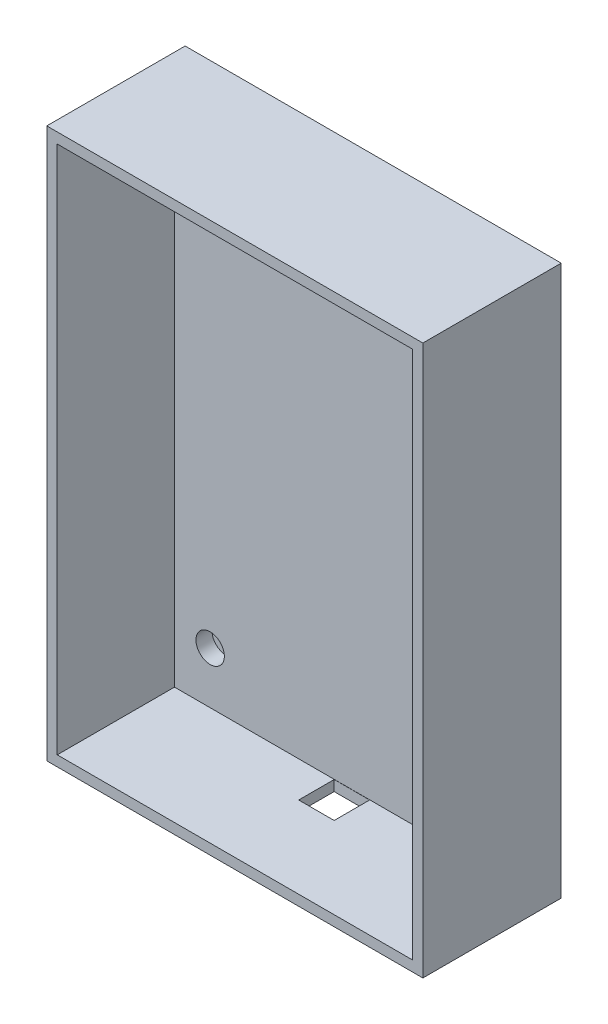
ISO-10303-21;
HEADER;
FILE_DESCRIPTION(('STEP AP214'),'2;1');
FILE_NAME('part.step','',(''),(''),'','','');
FILE_SCHEMA(('AUTOMOTIVE_DESIGN { 1 0 10303 214 1 1 1 1 }'));
ENDSEC;
DATA;
#1=APPLICATION_CONTEXT('core data for automotive mechanical design processes');
#2=APPLICATION_PROTOCOL_DEFINITION('international standard','automotive_design',2000,#1);
#3=PRODUCT_CONTEXT('',#1,'mechanical');
#4=PRODUCT('Part','Part','',(#3));
#5=PRODUCT_RELATED_PRODUCT_CATEGORY('part','',(#4));
#6=PRODUCT_DEFINITION_FORMATION('','',#4);
#7=PRODUCT_DEFINITION_CONTEXT('part definition',#1,'design');
#8=PRODUCT_DEFINITION('design','',#6,#7);
#9=PRODUCT_DEFINITION_SHAPE('','',#8);
#10=(LENGTH_UNIT() NAMED_UNIT(*) SI_UNIT(.MILLI.,.METRE.));
#11=(NAMED_UNIT(*) PLANE_ANGLE_UNIT() SI_UNIT($,.RADIAN.));
#12=(NAMED_UNIT(*) SI_UNIT($,.STERADIAN.) SOLID_ANGLE_UNIT());
#13=UNCERTAINTY_MEASURE_WITH_UNIT(LENGTH_MEASURE(1.E-05),#10,'distance_accuracy_value','');
#14=(GEOMETRIC_REPRESENTATION_CONTEXT(3) GLOBAL_UNCERTAINTY_ASSIGNED_CONTEXT((#13)) GLOBAL_UNIT_ASSIGNED_CONTEXT((#10,
#11,#12)) REPRESENTATION_CONTEXT('',''));
#15=CARTESIAN_POINT('',(0.,0.,0.));
#16=DIRECTION('',(0.,0.,1.));
#17=DIRECTION('',(1.,0.,0.));
#18=AXIS2_PLACEMENT_3D('',#15,#16,#17);
#19=CARTESIAN_POINT('',(53.,77.5,36.));
#20=DIRECTION('',(-1.,0.,0.));
#21=DIRECTION('',(0.,-1.,0.));
#22=AXIS2_PLACEMENT_3D('',#19,#20,#21);
#23=PLANE('',#22);
#24=DIRECTION('',(0.,0.,-1.));
#25=VECTOR('',#24,1.);
#26=CARTESIAN_POINT('',(53.,-77.5,36.));
#27=LINE('',#26,#25);
#28=CARTESIAN_POINT('',(53.,-77.5,36.));
#29=VERTEX_POINT('',#28);
#30=CARTESIAN_POINT('',(53.,-77.5,-3.));
#31=VERTEX_POINT('',#30);
#32=EDGE_CURVE('E135',#29,#31,#27,.T.);
#33=ORIENTED_EDGE('',*,*,#32,.T.);
#34=DIRECTION('',(0.,-1.,0.));
#35=VECTOR('',#34,1.);
#36=CARTESIAN_POINT('',(53.,77.5,-3.));
#37=LINE('',#36,#35);
#38=CARTESIAN_POINT('',(53.,77.5,-3.));
#39=VERTEX_POINT('',#38);
#40=EDGE_CURVE('E139',#39,#31,#37,.T.);
#41=ORIENTED_EDGE('',*,*,#40,.F.);
#42=DIRECTION('',(0.,0.,-1.));
#43=VECTOR('',#42,1.);
#44=CARTESIAN_POINT('',(53.,77.5,36.));
#45=LINE('',#44,#43);
#46=CARTESIAN_POINT('',(53.,77.5,36.));
#47=VERTEX_POINT('',#46);
#48=EDGE_CURVE('E257',#47,#39,#45,.T.);
#49=ORIENTED_EDGE('',*,*,#48,.F.);
#50=DIRECTION('',(0.,1.,0.));
#51=VECTOR('',#50,1.);
#52=CARTESIAN_POINT('',(53.,77.5,36.));
#53=LINE('',#52,#51);
#54=EDGE_CURVE('E141',#29,#47,#53,.T.);
#55=ORIENTED_EDGE('',*,*,#54,.F.);
#56=EDGE_LOOP('',(#33,#41,#49,#55));
#57=FACE_BOUND('',#56,.T.);
#58=ADVANCED_FACE('F43',(#57),#23,.F.);
#59=CARTESIAN_POINT('',(-53.,77.5,36.));
#60=DIRECTION('',(0.,-1.,0.));
#61=DIRECTION('',(0.,0.,-1.));
#62=AXIS2_PLACEMENT_3D('',#59,#60,#61);
#63=PLANE('',#62);
#64=ORIENTED_EDGE('',*,*,#48,.T.);
#65=DIRECTION('',(1.,0.,0.));
#66=VECTOR('',#65,1.);
#67=CARTESIAN_POINT('',(53.,77.5,-3.));
#68=LINE('',#67,#66);
#69=CARTESIAN_POINT('',(-53.,77.5,-3.));
#70=VERTEX_POINT('',#69);
#71=EDGE_CURVE('E161',#70,#39,#68,.T.);
#72=ORIENTED_EDGE('',*,*,#71,.F.);
#73=DIRECTION('',(0.,0.,-1.));
#74=VECTOR('',#73,1.);
#75=CARTESIAN_POINT('',(-53.,77.5,36.));
#76=LINE('',#75,#74);
#77=CARTESIAN_POINT('',(-53.,77.5,36.));
#78=VERTEX_POINT('',#77);
#79=EDGE_CURVE('E254',#78,#70,#76,.T.);
#80=ORIENTED_EDGE('',*,*,#79,.F.);
#81=DIRECTION('',(-1.,0.,0.));
#82=VECTOR('',#81,1.);
#83=CARTESIAN_POINT('',(-53.,77.5,36.));
#84=LINE('',#83,#82);
#85=EDGE_CURVE('E244',#47,#78,#84,.T.);
#86=ORIENTED_EDGE('',*,*,#85,.F.);
#87=EDGE_LOOP('',(#64,#72,#80,#86));
#88=FACE_BOUND('',#87,.T.);
#89=ADVANCED_FACE('F329',(#88),#63,.F.);
#90=CARTESIAN_POINT('',(-53.,77.5,36.));
#91=DIRECTION('',(1.,0.,0.));
#92=DIRECTION('',(0.,1.,0.));
#93=AXIS2_PLACEMENT_3D('',#90,#91,#92);
#94=PLANE('',#93);
#95=ORIENTED_EDGE('',*,*,#79,.T.);
#96=DIRECTION('',(0.,1.,0.));
#97=VECTOR('',#96,1.);
#98=CARTESIAN_POINT('',(-53.,77.5,-3.));
#99=LINE('',#98,#97);
#100=CARTESIAN_POINT('',(-53.,-77.5,-3.));
#101=VERTEX_POINT('',#100);
#102=EDGE_CURVE('E156',#101,#70,#99,.T.);
#103=ORIENTED_EDGE('',*,*,#102,.F.);
#104=DIRECTION('',(0.,0.,-1.));
#105=VECTOR('',#104,1.);
#106=CARTESIAN_POINT('',(-53.,-77.5,36.));
#107=LINE('',#106,#105);
#108=CARTESIAN_POINT('',(-53.,-77.5,36.));
#109=VERTEX_POINT('',#108);
#110=EDGE_CURVE('E145',#109,#101,#107,.T.);
#111=ORIENTED_EDGE('',*,*,#110,.F.);
#112=DIRECTION('',(0.,-1.,0.));
#113=VECTOR('',#112,1.);
#114=CARTESIAN_POINT('',(-53.,77.5,36.));
#115=LINE('',#114,#113);
#116=EDGE_CURVE('E247',#78,#109,#115,.T.);
#117=ORIENTED_EDGE('',*,*,#116,.F.);
#118=EDGE_LOOP('',(#95,#103,#111,#117));
#119=FACE_BOUND('',#118,.T.);
#120=ADVANCED_FACE('F333',(#119),#94,.F.);
#121=CARTESIAN_POINT('',(-53.,-77.5,36.));
#122=DIRECTION('',(0.,1.,0.));
#123=DIRECTION('',(0.,0.,1.));
#124=AXIS2_PLACEMENT_3D('',#121,#122,#123);
#125=PLANE('',#124);
#126=DIRECTION('',(-1.,0.,0.));
#127=VECTOR('',#126,1.);
#128=CARTESIAN_POINT('',(-5.,-77.5,13.));
#129=LINE('',#128,#127);
#130=CARTESIAN_POINT('',(5.,-77.5,13.));
#131=VERTEX_POINT('',#130);
#132=CARTESIAN_POINT('',(-5.,-77.5,13.));
#133=VERTEX_POINT('',#132);
#134=EDGE_CURVE('E178',#131,#133,#129,.T.);
#135=ORIENTED_EDGE('',*,*,#134,.F.);
#136=DIRECTION('',(0.,0.,1.));
#137=VECTOR('',#136,1.);
#138=CARTESIAN_POINT('',(5.,-77.5,13.));
#139=LINE('',#138,#137);
#140=CARTESIAN_POINT('',(5.,-77.5,3.));
#141=VERTEX_POINT('',#140);
#142=EDGE_CURVE('E60',#141,#131,#139,.T.);
#143=ORIENTED_EDGE('',*,*,#142,.F.);
#144=DIRECTION('',(1.,0.,0.));
#145=VECTOR('',#144,1.);
#146=CARTESIAN_POINT('',(-5.,-77.5,3.));
#147=LINE('',#146,#145);
#148=CARTESIAN_POINT('',(-5.,-77.5,3.));
#149=VERTEX_POINT('',#148);
#150=EDGE_CURVE('E185',#149,#141,#147,.T.);
#151=ORIENTED_EDGE('',*,*,#150,.F.);
#152=DIRECTION('',(0.,0.,-1.));
#153=VECTOR('',#152,1.);
#154=CARTESIAN_POINT('',(-5.,-77.5,13.));
#155=LINE('',#154,#153);
#156=EDGE_CURVE('E181',#133,#149,#155,.T.);
#157=ORIENTED_EDGE('',*,*,#156,.F.);
#158=EDGE_LOOP('',(#135,#143,#151,#157));
#159=FACE_BOUND('',#158,.T.);
#160=ORIENTED_EDGE('',*,*,#110,.T.);
#161=DIRECTION('',(-1.,0.,0.));
#162=VECTOR('',#161,1.);
#163=CARTESIAN_POINT('',(53.,-77.5,-3.));
#164=LINE('',#163,#162);
#165=EDGE_CURVE('E149',#31,#101,#164,.T.);
#166=ORIENTED_EDGE('',*,*,#165,.F.);
#167=ORIENTED_EDGE('',*,*,#32,.F.);
#168=DIRECTION('',(1.,0.,0.));
#169=VECTOR('',#168,1.);
#170=CARTESIAN_POINT('',(-53.,-77.5,36.));
#171=LINE('',#170,#169);
#172=EDGE_CURVE('E146',#109,#29,#171,.T.);
#173=ORIENTED_EDGE('',*,*,#172,.F.);
#174=EDGE_LOOP('',(#160,#166,#167,#173));
#175=FACE_BOUND('',#174,.T.);
#176=ADVANCED_FACE('F150',(#159,#175),#125,.F.);
#177=CARTESIAN_POINT('',(0.,0.,36.));
#178=DIRECTION('',(0.,0.,1.));
#179=DIRECTION('',(1.,0.,0.));
#180=AXIS2_PLACEMENT_3D('',#177,#178,#179);
#181=PLANE('',#180);
#182=DIRECTION('',(0.,1.,0.));
#183=VECTOR('',#182,1.);
#184=CARTESIAN_POINT('',(50.05,77.5,36.));
#185=LINE('',#184,#183);
#186=CARTESIAN_POINT('',(50.05,-74.55,36.));
#187=VERTEX_POINT('',#186);
#188=CARTESIAN_POINT('',(50.05,74.55,36.));
#189=VERTEX_POINT('',#188);
#190=EDGE_CURVE('E230',#187,#189,#185,.T.);
#191=ORIENTED_EDGE('',*,*,#190,.F.);
#192=DIRECTION('',(1.,0.,0.));
#193=VECTOR('',#192,1.);
#194=CARTESIAN_POINT('',(-53.,-74.55,36.));
#195=LINE('',#194,#193);
#196=CARTESIAN_POINT('',(-50.05,-74.55,36.));
#197=VERTEX_POINT('',#196);
#198=EDGE_CURVE('E215',#197,#187,#195,.T.);
#199=ORIENTED_EDGE('',*,*,#198,.F.);
#200=DIRECTION('',(0.,-1.,0.));
#201=VECTOR('',#200,1.);
#202=CARTESIAN_POINT('',(-50.05,77.5,36.));
#203=LINE('',#202,#201);
#204=CARTESIAN_POINT('',(-50.05,74.55,36.));
#205=VERTEX_POINT('',#204);
#206=EDGE_CURVE('E236',#205,#197,#203,.T.);
#207=ORIENTED_EDGE('',*,*,#206,.F.);
#208=DIRECTION('',(-1.,0.,0.));
#209=VECTOR('',#208,1.);
#210=CARTESIAN_POINT('',(-53.,74.55,36.));
#211=LINE('',#210,#209);
#212=EDGE_CURVE('E233',#189,#205,#211,.T.);
#213=ORIENTED_EDGE('',*,*,#212,.F.);
#214=EDGE_LOOP('',(#191,#199,#207,#213));
#215=FACE_BOUND('',#214,.T.);
#216=ORIENTED_EDGE('',*,*,#54,.T.);
#217=ORIENTED_EDGE('',*,*,#85,.T.);
#218=ORIENTED_EDGE('',*,*,#116,.T.);
#219=ORIENTED_EDGE('',*,*,#172,.T.);
#220=EDGE_LOOP('',(#216,#217,#218,#219));
#221=FACE_BOUND('',#220,.T.);
#222=ADVANCED_FACE('F343',(#215,#221),#181,.T.);
#223=CARTESIAN_POINT('',(50.05,77.5,36.));
#224=DIRECTION('',(-1.,0.,0.));
#225=DIRECTION('',(0.,-1.,0.));
#226=AXIS2_PLACEMENT_3D('',#223,#224,#225);
#227=PLANE('',#226);
#228=DIRECTION('',(0.,1.,0.));
#229=VECTOR('',#228,1.);
#230=CARTESIAN_POINT('',(50.05,77.5,2.95));
#231=LINE('',#230,#229);
#232=CARTESIAN_POINT('',(50.05,-74.55,2.95));
#233=VERTEX_POINT('',#232);
#234=CARTESIAN_POINT('',(50.05,74.55,2.95));
#235=VERTEX_POINT('',#234);
#236=EDGE_CURVE('E193',#233,#235,#231,.T.);
#237=ORIENTED_EDGE('',*,*,#236,.F.);
#238=DIRECTION('',(0.,0.,-1.));
#239=VECTOR('',#238,1.);
#240=CARTESIAN_POINT('',(50.05,-74.55,36.));
#241=LINE('',#240,#239);
#242=EDGE_CURVE('E210',#187,#233,#241,.T.);
#243=ORIENTED_EDGE('',*,*,#242,.F.);
#244=ORIENTED_EDGE('',*,*,#190,.T.);
#245=DIRECTION('',(0.,0.,-1.));
#246=VECTOR('',#245,1.);
#247=CARTESIAN_POINT('',(50.05,74.55,36.));
#248=LINE('',#247,#246);
#249=EDGE_CURVE('E205',#189,#235,#248,.T.);
#250=ORIENTED_EDGE('',*,*,#249,.T.);
#251=EDGE_LOOP('',(#237,#243,#244,#250));
#252=FACE_BOUND('',#251,.T.);
#253=ADVANCED_FACE('F347',(#252),#227,.T.);
#254=CARTESIAN_POINT('',(-53.,74.55,36.));
#255=DIRECTION('',(0.,-1.,0.));
#256=DIRECTION('',(0.,0.,-1.));
#257=AXIS2_PLACEMENT_3D('',#254,#255,#256);
#258=PLANE('',#257);
#259=DIRECTION('',(-1.,0.,0.));
#260=VECTOR('',#259,1.);
#261=CARTESIAN_POINT('',(-53.,74.55,2.95));
#262=LINE('',#261,#260);
#263=CARTESIAN_POINT('',(-50.05,74.55,2.95));
#264=VERTEX_POINT('',#263);
#265=EDGE_CURVE('E204',#235,#264,#262,.T.);
#266=ORIENTED_EDGE('',*,*,#265,.F.);
#267=ORIENTED_EDGE('',*,*,#249,.F.);
#268=ORIENTED_EDGE('',*,*,#212,.T.);
#269=DIRECTION('',(0.,0.,-1.));
#270=VECTOR('',#269,1.);
#271=CARTESIAN_POINT('',(-50.05,74.55,36.));
#272=LINE('',#271,#270);
#273=EDGE_CURVE('E209',#205,#264,#272,.T.);
#274=ORIENTED_EDGE('',*,*,#273,.T.);
#275=EDGE_LOOP('',(#266,#267,#268,#274));
#276=FACE_BOUND('',#275,.T.);
#277=ADVANCED_FACE('F361',(#276),#258,.T.);
#278=CARTESIAN_POINT('',(-50.05,77.5,36.));
#279=DIRECTION('',(1.,0.,0.));
#280=DIRECTION('',(0.,1.,0.));
#281=AXIS2_PLACEMENT_3D('',#278,#279,#280);
#282=PLANE('',#281);
#283=DIRECTION('',(0.,-1.,0.));
#284=VECTOR('',#283,1.);
#285=CARTESIAN_POINT('',(-50.05,77.5,2.95));
#286=LINE('',#285,#284);
#287=CARTESIAN_POINT('',(-50.05,-74.55,2.95));
#288=VERTEX_POINT('',#287);
#289=EDGE_CURVE('E218',#264,#288,#286,.T.);
#290=ORIENTED_EDGE('',*,*,#289,.F.);
#291=ORIENTED_EDGE('',*,*,#273,.F.);
#292=ORIENTED_EDGE('',*,*,#206,.T.);
#293=DIRECTION('',(0.,0.,-1.));
#294=VECTOR('',#293,1.);
#295=CARTESIAN_POINT('',(-50.05,-74.55,36.));
#296=LINE('',#295,#294);
#297=EDGE_CURVE('E214',#197,#288,#296,.T.);
#298=ORIENTED_EDGE('',*,*,#297,.T.);
#299=EDGE_LOOP('',(#290,#291,#292,#298));
#300=FACE_BOUND('',#299,.T.);
#301=ADVANCED_FACE('F357',(#300),#282,.T.);
#302=CARTESIAN_POINT('',(-53.,-74.55,36.));
#303=DIRECTION('',(0.,1.,0.));
#304=DIRECTION('',(0.,0.,1.));
#305=AXIS2_PLACEMENT_3D('',#302,#303,#304);
#306=PLANE('',#305);
#307=DIRECTION('',(0.,0.,-1.));
#308=VECTOR('',#307,1.);
#309=CARTESIAN_POINT('',(4.99999999999999,-74.55,36.));
#310=LINE('',#309,#308);
#311=CARTESIAN_POINT('',(5.,-74.55,13.));
#312=VERTEX_POINT('',#311);
#313=CARTESIAN_POINT('',(5.,-74.55,3.));
#314=VERTEX_POINT('',#313);
#315=EDGE_CURVE('E11',#312,#314,#310,.T.);
#316=ORIENTED_EDGE('',*,*,#315,.F.);
#317=DIRECTION('',(1.,0.,0.));
#318=VECTOR('',#317,1.);
#319=CARTESIAN_POINT('',(-53.,-74.55,13.));
#320=LINE('',#319,#318);
#321=CARTESIAN_POINT('',(-5.,-74.55,13.));
#322=VERTEX_POINT('',#321);
#323=EDGE_CURVE('E260',#322,#312,#320,.T.);
#324=ORIENTED_EDGE('',*,*,#323,.F.);
#325=DIRECTION('',(0.,0.,1.));
#326=VECTOR('',#325,1.);
#327=CARTESIAN_POINT('',(-5.,-74.55,36.));
#328=LINE('',#327,#326);
#329=CARTESIAN_POINT('',(-5.,-74.55,3.));
#330=VERTEX_POINT('',#329);
#331=EDGE_CURVE('E263',#330,#322,#328,.T.);
#332=ORIENTED_EDGE('',*,*,#331,.F.);
#333=DIRECTION('',(-1.,0.,0.));
#334=VECTOR('',#333,1.);
#335=CARTESIAN_POINT('',(-53.,-74.55,3.));
#336=LINE('',#335,#334);
#337=EDGE_CURVE('E52',#314,#330,#336,.T.);
#338=ORIENTED_EDGE('',*,*,#337,.F.);
#339=EDGE_LOOP('',(#316,#324,#332,#338));
#340=FACE_BOUND('',#339,.T.);
#341=DIRECTION('',(1.,0.,0.));
#342=VECTOR('',#341,1.);
#343=CARTESIAN_POINT('',(-53.,-74.55,2.95));
#344=LINE('',#343,#342);
#345=EDGE_CURVE('E224',#288,#233,#344,.T.);
#346=ORIENTED_EDGE('',*,*,#345,.F.);
#347=ORIENTED_EDGE('',*,*,#297,.F.);
#348=ORIENTED_EDGE('',*,*,#198,.T.);
#349=ORIENTED_EDGE('',*,*,#242,.T.);
#350=EDGE_LOOP('',(#346,#347,#348,#349));
#351=FACE_BOUND('',#350,.T.);
#352=ADVANCED_FACE('F353',(#340,#351),#306,.T.);
#353=CARTESIAN_POINT('',(0.,0.,2.95));
#354=DIRECTION('',(0.,0.,1.));
#355=DIRECTION('',(1.,0.,0.));
#356=AXIS2_PLACEMENT_3D('',#353,#354,#355);
#357=PLANE('',#356);
#358=CARTESIAN_POINT('',(-40.,60.,2.95));
#359=DIRECTION('',(0.,0.,1.));
#360=DIRECTION('',(1.,0.,0.));
#361=AXIS2_PLACEMENT_3D('',#358,#359,#360);
#362=CIRCLE('',#361,3.99999999999999);
#363=CARTESIAN_POINT('',(-36.,60.,2.95));
#364=VERTEX_POINT('',#363);
#365=EDGE_CURVE('E462',#364,#364,#362,.T.);
#366=ORIENTED_EDGE('',*,*,#365,.F.);
#367=EDGE_LOOP('',(#366));
#368=FACE_BOUND('',#367,.T.);
#369=CARTESIAN_POINT('',(40.,60.,2.95));
#370=DIRECTION('',(0.,0.,1.));
#371=DIRECTION('',(1.,0.,0.));
#372=AXIS2_PLACEMENT_3D('',#369,#370,#371);
#373=CIRCLE('',#372,3.99999999999999);
#374=CARTESIAN_POINT('',(44.,60.,2.95));
#375=VERTEX_POINT('',#374);
#376=EDGE_CURVE('E292',#375,#375,#373,.T.);
#377=ORIENTED_EDGE('',*,*,#376,.F.);
#378=EDGE_LOOP('',(#377));
#379=FACE_BOUND('',#378,.T.);
#380=CARTESIAN_POINT('',(40.,-60.,2.95));
#381=DIRECTION('',(0.,0.,1.));
#382=DIRECTION('',(1.,0.,0.));
#383=AXIS2_PLACEMENT_3D('',#380,#381,#382);
#384=CIRCLE('',#383,3.99999999999999);
#385=CARTESIAN_POINT('',(44.,-60.,2.95));
#386=VERTEX_POINT('',#385);
#387=EDGE_CURVE('E276',#386,#386,#384,.T.);
#388=ORIENTED_EDGE('',*,*,#387,.F.);
#389=EDGE_LOOP('',(#388));
#390=FACE_BOUND('',#389,.T.);
#391=CARTESIAN_POINT('',(-40.,-60.,2.95));
#392=DIRECTION('',(0.,0.,1.));
#393=DIRECTION('',(1.,0.,0.));
#394=AXIS2_PLACEMENT_3D('',#391,#392,#393);
#395=CIRCLE('',#394,3.99999999999999);
#396=CARTESIAN_POINT('',(-36.,-60.,2.95));
#397=VERTEX_POINT('',#396);
#398=EDGE_CURVE('E271',#397,#397,#395,.T.);
#399=ORIENTED_EDGE('',*,*,#398,.F.);
#400=EDGE_LOOP('',(#399));
#401=FACE_BOUND('',#400,.T.);
#402=ORIENTED_EDGE('',*,*,#236,.T.);
#403=ORIENTED_EDGE('',*,*,#265,.T.);
#404=ORIENTED_EDGE('',*,*,#289,.T.);
#405=ORIENTED_EDGE('',*,*,#345,.T.);
#406=EDGE_LOOP('',(#402,#403,#404,#405));
#407=FACE_BOUND('',#406,.T.);
#408=ADVANCED_FACE('F349',(#368,#379,#390,#401,#407),#357,.T.);
#409=CARTESIAN_POINT('',(5.,-41.5,13.));
#410=DIRECTION('',(1.,0.,0.));
#411=DIRECTION('',(0.,0.,-1.));
#412=AXIS2_PLACEMENT_3D('',#409,#410,#411);
#413=PLANE('',#412);
#414=ORIENTED_EDGE('',*,*,#315,.T.);
#415=DIRECTION('',(0.,-1.,0.));
#416=VECTOR('',#415,1.);
#417=CARTESIAN_POINT('',(5.,-41.5,3.));
#418=LINE('',#417,#416);
#419=EDGE_CURVE('E190',#314,#141,#418,.T.);
#420=ORIENTED_EDGE('',*,*,#419,.T.);
#421=ORIENTED_EDGE('',*,*,#142,.T.);
#422=DIRECTION('',(0.,-1.,0.));
#423=VECTOR('',#422,1.);
#424=CARTESIAN_POINT('',(5.,-41.5,13.));
#425=LINE('',#424,#423);
#426=EDGE_CURVE('E189',#312,#131,#425,.T.);
#427=ORIENTED_EDGE('',*,*,#426,.F.);
#428=EDGE_LOOP('',(#414,#420,#421,#427));
#429=FACE_BOUND('',#428,.T.);
#430=ADVANCED_FACE('F352',(#429),#413,.F.);
#431=CARTESIAN_POINT('',(-5.,-41.5,3.));
#432=DIRECTION('',(0.,0.,-1.));
#433=DIRECTION('',(-1.,0.,0.));
#434=AXIS2_PLACEMENT_3D('',#431,#432,#433);
#435=PLANE('',#434);
#436=ORIENTED_EDGE('',*,*,#337,.T.);
#437=DIRECTION('',(0.,-1.,0.));
#438=VECTOR('',#437,1.);
#439=CARTESIAN_POINT('',(-5.,-41.5,3.));
#440=LINE('',#439,#438);
#441=EDGE_CURVE('E194',#330,#149,#440,.T.);
#442=ORIENTED_EDGE('',*,*,#441,.T.);
#443=ORIENTED_EDGE('',*,*,#150,.T.);
#444=ORIENTED_EDGE('',*,*,#419,.F.);
#445=EDGE_LOOP('',(#436,#442,#443,#444));
#446=FACE_BOUND('',#445,.T.);
#447=ADVANCED_FACE('F371',(#446),#435,.F.);
#448=CARTESIAN_POINT('',(-5.,-41.5,13.));
#449=DIRECTION('',(-1.,0.,0.));
#450=DIRECTION('',(0.,0.,1.));
#451=AXIS2_PLACEMENT_3D('',#448,#449,#450);
#452=PLANE('',#451);
#453=ORIENTED_EDGE('',*,*,#331,.T.);
#454=DIRECTION('',(0.,-1.,0.));
#455=VECTOR('',#454,1.);
#456=CARTESIAN_POINT('',(-5.,-41.5,13.));
#457=LINE('',#456,#455);
#458=EDGE_CURVE('E68',#322,#133,#457,.T.);
#459=ORIENTED_EDGE('',*,*,#458,.T.);
#460=ORIENTED_EDGE('',*,*,#156,.T.);
#461=ORIENTED_EDGE('',*,*,#441,.F.);
#462=EDGE_LOOP('',(#453,#459,#460,#461));
#463=FACE_BOUND('',#462,.T.);
#464=ADVANCED_FACE('F375',(#463),#452,.F.);
#465=CARTESIAN_POINT('',(-5.,-41.5,13.));
#466=DIRECTION('',(0.,0.,1.));
#467=DIRECTION('',(1.,0.,0.));
#468=AXIS2_PLACEMENT_3D('',#465,#466,#467);
#469=PLANE('',#468);
#470=ORIENTED_EDGE('',*,*,#323,.T.);
#471=ORIENTED_EDGE('',*,*,#426,.T.);
#472=ORIENTED_EDGE('',*,*,#134,.T.);
#473=ORIENTED_EDGE('',*,*,#458,.F.);
#474=EDGE_LOOP('',(#470,#471,#472,#473));
#475=FACE_BOUND('',#474,.T.);
#476=ADVANCED_FACE('F372',(#475),#469,.F.);
#477=CARTESIAN_POINT('',(0.,0.,-3.));
#478=DIRECTION('',(0.,0.,-1.));
#479=DIRECTION('',(-1.,0.,0.));
#480=AXIS2_PLACEMENT_3D('',#477,#478,#479);
#481=PLANE('',#480);
#482=CARTESIAN_POINT('',(-40.,60.,-3.));
#483=DIRECTION('',(0.,0.,-1.));
#484=DIRECTION('',(-1.,0.,0.));
#485=AXIS2_PLACEMENT_3D('',#482,#483,#484);
#486=CIRCLE('',#485,2.24999999999999);
#487=CARTESIAN_POINT('',(-42.25,60.,-3.));
#488=VERTEX_POINT('',#487);
#489=EDGE_CURVE('E46',#488,#488,#486,.T.);
#490=ORIENTED_EDGE('',*,*,#489,.F.);
#491=EDGE_LOOP('',(#490));
#492=FACE_BOUND('',#491,.T.);
#493=CARTESIAN_POINT('',(40.,60.,-3.));
#494=DIRECTION('',(0.,0.,-1.));
#495=DIRECTION('',(-1.,0.,0.));
#496=AXIS2_PLACEMENT_3D('',#493,#494,#495);
#497=CIRCLE('',#496,2.24999999999999);
#498=CARTESIAN_POINT('',(37.75,60.,-3.));
#499=VERTEX_POINT('',#498);
#500=EDGE_CURVE('E273',#499,#499,#497,.T.);
#501=ORIENTED_EDGE('',*,*,#500,.F.);
#502=EDGE_LOOP('',(#501));
#503=FACE_BOUND('',#502,.T.);
#504=CARTESIAN_POINT('',(40.,-60.,-3.));
#505=DIRECTION('',(0.,0.,-1.));
#506=DIRECTION('',(-1.,0.,0.));
#507=AXIS2_PLACEMENT_3D('',#504,#505,#506);
#508=CIRCLE('',#507,2.24999999999999);
#509=CARTESIAN_POINT('',(37.75,-60.,-3.));
#510=VERTEX_POINT('',#509);
#511=EDGE_CURVE('E268',#510,#510,#508,.T.);
#512=ORIENTED_EDGE('',*,*,#511,.F.);
#513=EDGE_LOOP('',(#512));
#514=FACE_BOUND('',#513,.T.);
#515=CARTESIAN_POINT('',(-40.,-60.,-3.));
#516=DIRECTION('',(0.,0.,-1.));
#517=DIRECTION('',(-1.,0.,0.));
#518=AXIS2_PLACEMENT_3D('',#515,#516,#517);
#519=CIRCLE('',#518,2.24999999999999);
#520=CARTESIAN_POINT('',(-42.25,-60.,-3.));
#521=VERTEX_POINT('',#520);
#522=EDGE_CURVE('E163',#521,#521,#519,.T.);
#523=ORIENTED_EDGE('',*,*,#522,.F.);
#524=EDGE_LOOP('',(#523));
#525=FACE_BOUND('',#524,.T.);
#526=ORIENTED_EDGE('',*,*,#40,.T.);
#527=ORIENTED_EDGE('',*,*,#165,.T.);
#528=ORIENTED_EDGE('',*,*,#102,.T.);
#529=ORIENTED_EDGE('',*,*,#71,.T.);
#530=EDGE_LOOP('',(#526,#527,#528,#529));
#531=FACE_BOUND('',#530,.T.);
#532=ADVANCED_FACE('F159',(#492,#503,#514,#525,#531),#481,.T.);
#533=CARTESIAN_POINT('',(-40.,-60.,2.95));
#534=DIRECTION('',(0.,0.,1.));
#535=DIRECTION('',(1.,0.,0.));
#536=AXIS2_PLACEMENT_3D('',#533,#534,#535);
#537=CYLINDRICAL_SURFACE('',#536,2.24999999999999);
#538=ORIENTED_EDGE('',*,*,#522,.T.);
#539=EDGE_LOOP('',(#538));
#540=FACE_BOUND('',#539,.T.);
#541=CARTESIAN_POINT('',(-40.,-60.,-1.55));
#542=DIRECTION('',(0.,0.,1.));
#543=DIRECTION('',(1.,0.,0.));
#544=AXIS2_PLACEMENT_3D('',#541,#542,#543);
#545=CIRCLE('',#544,2.25);
#546=CARTESIAN_POINT('',(-37.75,-60.,-1.55));
#547=VERTEX_POINT('',#546);
#548=EDGE_CURVE('E167',#547,#547,#545,.T.);
#549=ORIENTED_EDGE('',*,*,#548,.T.);
#550=EDGE_LOOP('',(#549));
#551=FACE_BOUND('',#550,.T.);
#552=ADVANCED_FACE('F313',(#540,#551),#537,.F.);
#553=CARTESIAN_POINT('',(-37.75,-60.,-1.55));
#554=DIRECTION('',(0.,0.,-1.));
#555=DIRECTION('',(-1.,0.,0.));
#556=AXIS2_PLACEMENT_3D('',#553,#554,#555);
#557=PLANE('',#556);
#558=ORIENTED_EDGE('',*,*,#548,.F.);
#559=EDGE_LOOP('',(#558));
#560=FACE_BOUND('',#559,.T.);
#561=CARTESIAN_POINT('',(-40.,-60.,-1.55));
#562=DIRECTION('',(0.,0.,1.));
#563=DIRECTION('',(1.,0.,0.));
#564=AXIS2_PLACEMENT_3D('',#561,#562,#563);
#565=CIRCLE('',#564,4.);
#566=CARTESIAN_POINT('',(-36.,-60.,-1.55));
#567=VERTEX_POINT('',#566);
#568=EDGE_CURVE('E304',#567,#567,#565,.T.);
#569=ORIENTED_EDGE('',*,*,#568,.T.);
#570=EDGE_LOOP('',(#569));
#571=FACE_BOUND('',#570,.T.);
#572=ADVANCED_FACE('F315',(#560,#571),#557,.F.);
#573=CARTESIAN_POINT('',(-40.,-60.,2.95));
#574=DIRECTION('',(0.,0.,1.));
#575=DIRECTION('',(1.,0.,0.));
#576=AXIS2_PLACEMENT_3D('',#573,#574,#575);
#577=CYLINDRICAL_SURFACE('',#576,3.99999999999999);
#578=ORIENTED_EDGE('',*,*,#568,.F.);
#579=EDGE_LOOP('',(#578));
#580=FACE_BOUND('',#579,.T.);
#581=ORIENTED_EDGE('',*,*,#398,.T.);
#582=EDGE_LOOP('',(#581));
#583=FACE_BOUND('',#582,.T.);
#584=ADVANCED_FACE('F317',(#580,#583),#577,.F.);
#585=CARTESIAN_POINT('',(40.,-60.,2.95));
#586=DIRECTION('',(0.,0.,1.));
#587=DIRECTION('',(1.,0.,0.));
#588=AXIS2_PLACEMENT_3D('',#585,#586,#587);
#589=CYLINDRICAL_SURFACE('',#588,2.24999999999999);
#590=ORIENTED_EDGE('',*,*,#511,.T.);
#591=EDGE_LOOP('',(#590));
#592=FACE_BOUND('',#591,.T.);
#593=CARTESIAN_POINT('',(40.,-60.,-1.55));
#594=DIRECTION('',(0.,0.,1.));
#595=DIRECTION('',(1.,0.,0.));
#596=AXIS2_PLACEMENT_3D('',#593,#594,#595);
#597=CIRCLE('',#596,2.25);
#598=CARTESIAN_POINT('',(42.25,-60.,-1.55));
#599=VERTEX_POINT('',#598);
#600=EDGE_CURVE('E272',#599,#599,#597,.T.);
#601=ORIENTED_EDGE('',*,*,#600,.T.);
#602=EDGE_LOOP('',(#601));
#603=FACE_BOUND('',#602,.T.);
#604=ADVANCED_FACE('F323',(#592,#603),#589,.F.);
#605=CARTESIAN_POINT('',(42.25,-60.,-1.55));
#606=DIRECTION('',(0.,0.,-1.));
#607=DIRECTION('',(-1.,0.,0.));
#608=AXIS2_PLACEMENT_3D('',#605,#606,#607);
#609=PLANE('',#608);
#610=ORIENTED_EDGE('',*,*,#600,.F.);
#611=EDGE_LOOP('',(#610));
#612=FACE_BOUND('',#611,.T.);
#613=CARTESIAN_POINT('',(40.,-60.,-1.55));
#614=DIRECTION('',(0.,0.,1.));
#615=DIRECTION('',(1.,0.,0.));
#616=AXIS2_PLACEMENT_3D('',#613,#614,#615);
#617=CIRCLE('',#616,4.);
#618=CARTESIAN_POINT('',(44.,-60.,-1.55));
#619=VERTEX_POINT('',#618);
#620=EDGE_CURVE('E283',#619,#619,#617,.T.);
#621=ORIENTED_EDGE('',*,*,#620,.T.);
#622=EDGE_LOOP('',(#621));
#623=FACE_BOUND('',#622,.T.);
#624=ADVANCED_FACE('F396',(#612,#623),#609,.F.);
#625=CARTESIAN_POINT('',(40.,-60.,2.95));
#626=DIRECTION('',(0.,0.,1.));
#627=DIRECTION('',(1.,0.,0.));
#628=AXIS2_PLACEMENT_3D('',#625,#626,#627);
#629=CYLINDRICAL_SURFACE('',#628,3.99999999999999);
#630=ORIENTED_EDGE('',*,*,#620,.F.);
#631=EDGE_LOOP('',(#630));
#632=FACE_BOUND('',#631,.T.);
#633=ORIENTED_EDGE('',*,*,#387,.T.);
#634=EDGE_LOOP('',(#633));
#635=FACE_BOUND('',#634,.T.);
#636=ADVANCED_FACE('F402',(#632,#635),#629,.F.);
#637=CARTESIAN_POINT('',(40.,60.,2.95));
#638=DIRECTION('',(0.,0.,1.));
#639=DIRECTION('',(1.,0.,0.));
#640=AXIS2_PLACEMENT_3D('',#637,#638,#639);
#641=CYLINDRICAL_SURFACE('',#640,2.24999999999999);
#642=ORIENTED_EDGE('',*,*,#500,.T.);
#643=EDGE_LOOP('',(#642));
#644=FACE_BOUND('',#643,.T.);
#645=CARTESIAN_POINT('',(40.,60.,-1.55));
#646=DIRECTION('',(0.,0.,1.));
#647=DIRECTION('',(1.,0.,0.));
#648=AXIS2_PLACEMENT_3D('',#645,#646,#647);
#649=CIRCLE('',#648,2.25);
#650=CARTESIAN_POINT('',(42.25,60.,-1.55));
#651=VERTEX_POINT('',#650);
#652=EDGE_CURVE('E277',#651,#651,#649,.T.);
#653=ORIENTED_EDGE('',*,*,#652,.T.);
#654=EDGE_LOOP('',(#653));
#655=FACE_BOUND('',#654,.T.);
#656=ADVANCED_FACE('F408',(#644,#655),#641,.F.);
#657=CARTESIAN_POINT('',(42.25,60.,-1.55));
#658=DIRECTION('',(0.,0.,-1.));
#659=DIRECTION('',(-1.,0.,0.));
#660=AXIS2_PLACEMENT_3D('',#657,#658,#659);
#661=PLANE('',#660);
#662=ORIENTED_EDGE('',*,*,#652,.F.);
#663=EDGE_LOOP('',(#662));
#664=FACE_BOUND('',#663,.T.);
#665=CARTESIAN_POINT('',(40.,60.,-1.55));
#666=DIRECTION('',(0.,0.,1.));
#667=DIRECTION('',(1.,0.,0.));
#668=AXIS2_PLACEMENT_3D('',#665,#666,#667);
#669=CIRCLE('',#668,4.);
#670=CARTESIAN_POINT('',(44.,60.,-1.55));
#671=VERTEX_POINT('',#670);
#672=EDGE_CURVE('E286',#671,#671,#669,.T.);
#673=ORIENTED_EDGE('',*,*,#672,.T.);
#674=EDGE_LOOP('',(#673));
#675=FACE_BOUND('',#674,.T.);
#676=ADVANCED_FACE('F433',(#664,#675),#661,.F.);
#677=CARTESIAN_POINT('',(40.,60.,2.95));
#678=DIRECTION('',(0.,0.,1.));
#679=DIRECTION('',(1.,0.,0.));
#680=AXIS2_PLACEMENT_3D('',#677,#678,#679);
#681=CYLINDRICAL_SURFACE('',#680,3.99999999999999);
#682=ORIENTED_EDGE('',*,*,#672,.F.);
#683=EDGE_LOOP('',(#682));
#684=FACE_BOUND('',#683,.T.);
#685=ORIENTED_EDGE('',*,*,#376,.T.);
#686=EDGE_LOOP('',(#685));
#687=FACE_BOUND('',#686,.T.);
#688=ADVANCED_FACE('F438',(#684,#687),#681,.F.);
#689=CARTESIAN_POINT('',(-40.,60.,2.95));
#690=DIRECTION('',(0.,0.,1.));
#691=DIRECTION('',(1.,0.,0.));
#692=AXIS2_PLACEMENT_3D('',#689,#690,#691);
#693=CYLINDRICAL_SURFACE('',#692,2.24999999999999);
#694=ORIENTED_EDGE('',*,*,#489,.T.);
#695=EDGE_LOOP('',(#694));
#696=FACE_BOUND('',#695,.T.);
#697=CARTESIAN_POINT('',(-40.,60.,-1.55));
#698=DIRECTION('',(0.,0.,1.));
#699=DIRECTION('',(1.,0.,0.));
#700=AXIS2_PLACEMENT_3D('',#697,#698,#699);
#701=CIRCLE('',#700,2.25);
#702=CARTESIAN_POINT('',(-37.75,60.,-1.55));
#703=VERTEX_POINT('',#702);
#704=EDGE_CURVE('E466',#703,#703,#701,.T.);
#705=ORIENTED_EDGE('',*,*,#704,.T.);
#706=EDGE_LOOP('',(#705));
#707=FACE_BOUND('',#706,.T.);
#708=ADVANCED_FACE('F442',(#696,#707),#693,.F.);
#709=CARTESIAN_POINT('',(-37.75,60.,-1.55));
#710=DIRECTION('',(0.,0.,-1.));
#711=DIRECTION('',(-1.,0.,0.));
#712=AXIS2_PLACEMENT_3D('',#709,#710,#711);
#713=PLANE('',#712);
#714=ORIENTED_EDGE('',*,*,#704,.F.);
#715=EDGE_LOOP('',(#714));
#716=FACE_BOUND('',#715,.T.);
#717=CARTESIAN_POINT('',(-40.,60.,-1.55));
#718=DIRECTION('',(0.,0.,1.));
#719=DIRECTION('',(1.,0.,0.));
#720=AXIS2_PLACEMENT_3D('',#717,#718,#719);
#721=CIRCLE('',#720,4.);
#722=CARTESIAN_POINT('',(-36.,60.,-1.55));
#723=VERTEX_POINT('',#722);
#724=EDGE_CURVE('E459',#723,#723,#721,.T.);
#725=ORIENTED_EDGE('',*,*,#724,.T.);
#726=EDGE_LOOP('',(#725));
#727=FACE_BOUND('',#726,.T.);
#728=ADVANCED_FACE('F446',(#716,#727),#713,.F.);
#729=CARTESIAN_POINT('',(-40.,60.,2.95));
#730=DIRECTION('',(0.,0.,1.));
#731=DIRECTION('',(1.,0.,0.));
#732=AXIS2_PLACEMENT_3D('',#729,#730,#731);
#733=CYLINDRICAL_SURFACE('',#732,3.99999999999999);
#734=ORIENTED_EDGE('',*,*,#724,.F.);
#735=EDGE_LOOP('',(#734));
#736=FACE_BOUND('',#735,.T.);
#737=ORIENTED_EDGE('',*,*,#365,.T.);
#738=EDGE_LOOP('',(#737));
#739=FACE_BOUND('',#738,.T.);
#740=ADVANCED_FACE('F450',(#736,#739),#733,.F.);
#741=CLOSED_SHELL('',(#58,#89,#120,#176,#222,#253,#277,#301,#352,#408,#430,#447,#464,#476,#532,
#552,#572,#584,#604,#624,#636,#656,#676,#688,#708,#728,#740));
#742=MANIFOLD_SOLID_BREP('B2',#741);
#743=ADVANCED_BREP_SHAPE_REPRESENTATION('',(#18,#742),#14);
#744=SHAPE_DEFINITION_REPRESENTATION(#9,#743);
ENDSEC;
END-ISO-10303-21;
